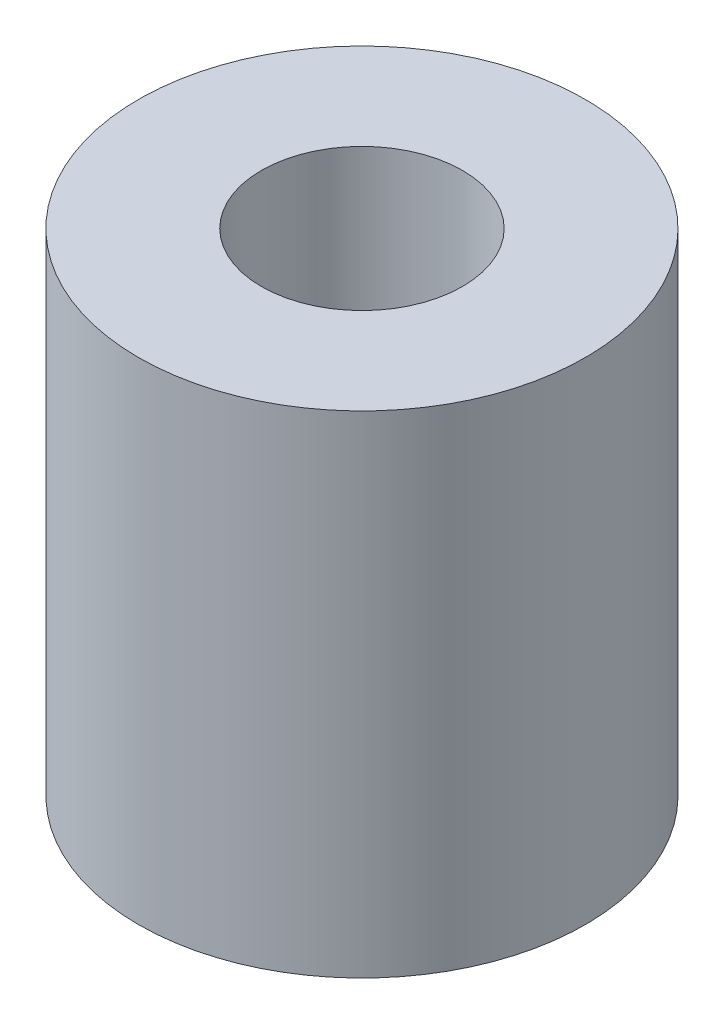
ISO-10303-21;
HEADER;
FILE_DESCRIPTION(('STEP AP214'),'2;1');
FILE_NAME('part.step','',(''),(''),'','','');
FILE_SCHEMA(('AUTOMOTIVE_DESIGN { 1 0 10303 214 1 1 1 1 }'));
ENDSEC;
DATA;
#1=APPLICATION_CONTEXT('core data for automotive mechanical design processes');
#2=APPLICATION_PROTOCOL_DEFINITION('international standard','automotive_design',2000,#1);
#3=PRODUCT_CONTEXT('',#1,'mechanical');
#4=PRODUCT('Part','Part','',(#3));
#5=PRODUCT_RELATED_PRODUCT_CATEGORY('part','',(#4));
#6=PRODUCT_DEFINITION_FORMATION('','',#4);
#7=PRODUCT_DEFINITION_CONTEXT('part definition',#1,'design');
#8=PRODUCT_DEFINITION('design','',#6,#7);
#9=PRODUCT_DEFINITION_SHAPE('','',#8);
#10=(LENGTH_UNIT() NAMED_UNIT(*) SI_UNIT(.MILLI.,.METRE.));
#11=(NAMED_UNIT(*) PLANE_ANGLE_UNIT() SI_UNIT($,.RADIAN.));
#12=(NAMED_UNIT(*) SI_UNIT($,.STERADIAN.) SOLID_ANGLE_UNIT());
#13=UNCERTAINTY_MEASURE_WITH_UNIT(LENGTH_MEASURE(1.E-05),#10,'distance_accuracy_value','');
#14=(GEOMETRIC_REPRESENTATION_CONTEXT(3) GLOBAL_UNCERTAINTY_ASSIGNED_CONTEXT((#13)) GLOBAL_UNIT_ASSIGNED_CONTEXT((#10,
#11,#12)) REPRESENTATION_CONTEXT('',''));
#15=CARTESIAN_POINT('',(0.,0.,0.));
#16=DIRECTION('',(0.,0.,1.));
#17=DIRECTION('',(1.,0.,0.));
#18=AXIS2_PLACEMENT_3D('',#15,#16,#17);
#19=CARTESIAN_POINT('',(0.,21.976,0.));
#20=DIRECTION('',(0.,-1.,0.));
#21=DIRECTION('',(0.,0.,-1.));
#22=AXIS2_PLACEMENT_3D('',#19,#20,#21);
#23=CYLINDRICAL_SURFACE('',#22,10.);
#24=CARTESIAN_POINT('',(0.,21.976,0.));
#25=DIRECTION('',(0.,1.,0.));
#26=DIRECTION('',(0.,0.,1.));
#27=AXIS2_PLACEMENT_3D('',#24,#25,#26);
#28=CIRCLE('',#27,10.);
#29=CARTESIAN_POINT('',(0.,21.976,10.));
#30=VERTEX_POINT('',#29);
#31=EDGE_CURVE('E10',#30,#30,#28,.T.);
#32=ORIENTED_EDGE('',*,*,#31,.F.);
#33=EDGE_LOOP('',(#32));
#34=FACE_BOUND('',#33,.T.);
#35=CARTESIAN_POINT('',(0.,0.,0.));
#36=DIRECTION('',(0.,1.,0.));
#37=DIRECTION('',(0.,0.,1.));
#38=AXIS2_PLACEMENT_3D('',#35,#36,#37);
#39=CIRCLE('',#38,10.);
#40=CARTESIAN_POINT('',(0.,0.,10.));
#41=VERTEX_POINT('',#40);
#42=EDGE_CURVE('E40',#41,#41,#39,.T.);
#43=ORIENTED_EDGE('',*,*,#42,.T.);
#44=EDGE_LOOP('',(#43));
#45=FACE_BOUND('',#44,.T.);
#46=ADVANCED_FACE('F37',(#34,#45),#23,.T.);
#47=CARTESIAN_POINT('',(0.,21.976,0.));
#48=DIRECTION('',(0.,1.,0.));
#49=DIRECTION('',(0.,0.,1.));
#50=AXIS2_PLACEMENT_3D('',#47,#48,#49);
#51=PLANE('',#50);
#52=CARTESIAN_POINT('',(0.,21.976,0.));
#53=DIRECTION('',(0.,1.,0.));
#54=DIRECTION('',(0.,0.,1.));
#55=AXIS2_PLACEMENT_3D('',#52,#53,#54);
#56=CIRCLE('',#55,4.5);
#57=CARTESIAN_POINT('',(0.,21.976,4.5));
#58=VERTEX_POINT('',#57);
#59=EDGE_CURVE('E51',#58,#58,#56,.T.);
#60=ORIENTED_EDGE('',*,*,#59,.F.);
#61=EDGE_LOOP('',(#60));
#62=FACE_BOUND('',#61,.T.);
#63=ORIENTED_EDGE('',*,*,#31,.T.);
#64=EDGE_LOOP('',(#63));
#65=FACE_BOUND('',#64,.T.);
#66=ADVANCED_FACE('F68',(#62,#65),#51,.T.);
#67=CARTESIAN_POINT('',(0.,0.,0.));
#68=DIRECTION('',(0.,1.,0.));
#69=DIRECTION('',(0.,0.,1.));
#70=AXIS2_PLACEMENT_3D('',#67,#68,#69);
#71=PLANE('',#70);
#72=CARTESIAN_POINT('',(0.,0.,0.));
#73=DIRECTION('',(0.,1.,0.));
#74=DIRECTION('',(0.,0.,1.));
#75=AXIS2_PLACEMENT_3D('',#72,#73,#74);
#76=CIRCLE('',#75,4.5);
#77=CARTESIAN_POINT('',(0.,0.,4.5));
#78=VERTEX_POINT('',#77);
#79=EDGE_CURVE('E49',#78,#78,#76,.T.);
#80=ORIENTED_EDGE('',*,*,#79,.T.);
#81=EDGE_LOOP('',(#80));
#82=FACE_BOUND('',#81,.T.);
#83=ORIENTED_EDGE('',*,*,#42,.F.);
#84=EDGE_LOOP('',(#83));
#85=FACE_BOUND('',#84,.T.);
#86=ADVANCED_FACE('F59',(#82,#85),#71,.F.);
#87=CARTESIAN_POINT('',(0.,0.,0.));
#88=DIRECTION('',(0.,1.,0.));
#89=DIRECTION('',(0.,0.,1.));
#90=AXIS2_PLACEMENT_3D('',#87,#88,#89);
#91=CYLINDRICAL_SURFACE('',#90,4.5);
#92=ORIENTED_EDGE('',*,*,#79,.F.);
#93=EDGE_LOOP('',(#92));
#94=FACE_BOUND('',#93,.T.);
#95=ORIENTED_EDGE('',*,*,#59,.T.);
#96=EDGE_LOOP('',(#95));
#97=FACE_BOUND('',#96,.T.);
#98=ADVANCED_FACE('F62',(#94,#97),#91,.F.);
#99=CLOSED_SHELL('',(#46,#66,#86,#98));
#100=MANIFOLD_SOLID_BREP('B2',#99);
#101=ADVANCED_BREP_SHAPE_REPRESENTATION('',(#18,#100),#14);
#102=SHAPE_DEFINITION_REPRESENTATION(#9,#101);
ENDSEC;
END-ISO-10303-21;
